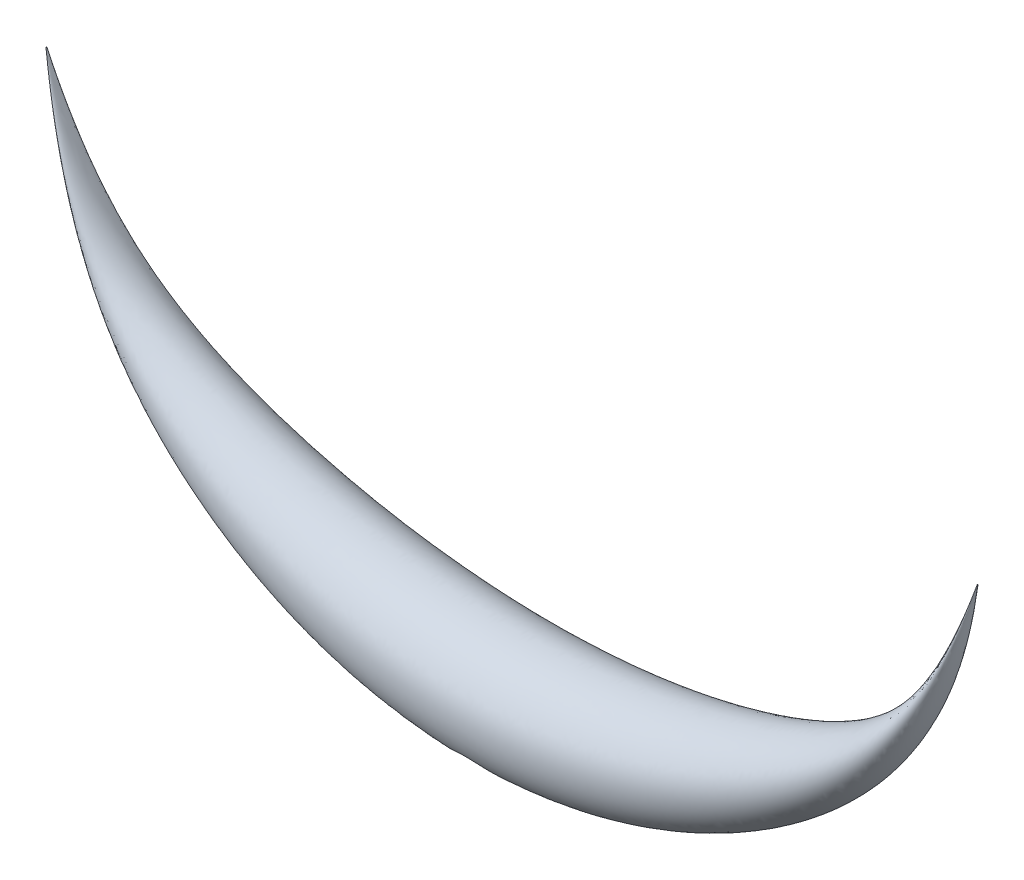
ISO-10303-21;
HEADER;
FILE_DESCRIPTION(('STEP AP214'),'2;1');
FILE_NAME('part.step','',(''),(''),'','','');
FILE_SCHEMA(('AUTOMOTIVE_DESIGN { 1 0 10303 214 1 1 1 1 }'));
ENDSEC;
DATA;
#1=APPLICATION_CONTEXT('core data for automotive mechanical design processes');
#2=APPLICATION_PROTOCOL_DEFINITION('international standard','automotive_design',2000,#1);
#3=PRODUCT_CONTEXT('',#1,'mechanical');
#4=PRODUCT('Part','Part','',(#3));
#5=PRODUCT_RELATED_PRODUCT_CATEGORY('part','',(#4));
#6=PRODUCT_DEFINITION_FORMATION('','',#4);
#7=PRODUCT_DEFINITION_CONTEXT('part definition',#1,'design');
#8=PRODUCT_DEFINITION('design','',#6,#7);
#9=PRODUCT_DEFINITION_SHAPE('','',#8);
#10=(LENGTH_UNIT() NAMED_UNIT(*) SI_UNIT(.MILLI.,.METRE.));
#11=(NAMED_UNIT(*) PLANE_ANGLE_UNIT() SI_UNIT($,.RADIAN.));
#12=(NAMED_UNIT(*) SI_UNIT($,.STERADIAN.) SOLID_ANGLE_UNIT());
#13=UNCERTAINTY_MEASURE_WITH_UNIT(LENGTH_MEASURE(1.E-05),#10,'distance_accuracy_value','');
#14=(GEOMETRIC_REPRESENTATION_CONTEXT(3) GLOBAL_UNCERTAINTY_ASSIGNED_CONTEXT((#13)) GLOBAL_UNIT_ASSIGNED_CONTEXT((#10,
#11,#12)) REPRESENTATION_CONTEXT('',''));
#15=CARTESIAN_POINT('',(0.,0.,0.));
#16=DIRECTION('',(0.,0.,1.));
#17=DIRECTION('',(1.,0.,0.));
#18=AXIS2_PLACEMENT_3D('',#15,#16,#17);
#19=CARTESIAN_POINT('',(-127.,76.2,0.));
#20=DIRECTION('',(1.,0.,0.));
#21=DIRECTION('',(0.,0.,-1.));
#22=AXIS2_PLACEMENT_3D('',#19,#20,#21);
#23=PLANE('',#22);
#24=CARTESIAN_POINT('',(-127.,76.2,0.));
#25=DIRECTION('',(1.,0.,0.));
#26=DIRECTION('',(0.,0.,-1.));
#27=AXIS2_PLACEMENT_3D('',#24,#25,#26);
#28=CIRCLE('',#27,0.126999999999999);
#29=CARTESIAN_POINT('',(-127.,76.2,-0.126999999999999));
#30=VERTEX_POINT('',#29);
#31=EDGE_CURVE('E93',#30,#30,#28,.T.);
#32=ORIENTED_EDGE('',*,*,#31,.F.);
#33=EDGE_LOOP('',(#32));
#34=FACE_BOUND('',#33,.T.);
#35=ADVANCED_FACE('F82',(#34),#23,.F.);
#36=CARTESIAN_POINT('',(127.,76.2,0.));
#37=DIRECTION('',(1.,0.,0.));
#38=DIRECTION('',(0.,0.,-1.));
#39=AXIS2_PLACEMENT_3D('',#36,#37,#38);
#40=PLANE('',#39);
#41=CARTESIAN_POINT('',(127.,76.2,0.));
#42=DIRECTION('',(1.,0.,0.));
#43=DIRECTION('',(0.,0.,-1.));
#44=AXIS2_PLACEMENT_3D('',#41,#42,#43);
#45=CIRCLE('',#44,0.127);
#46=CARTESIAN_POINT('',(127.,76.2,-0.127));
#47=VERTEX_POINT('',#46);
#48=EDGE_CURVE('E13',#47,#47,#45,.T.);
#49=ORIENTED_EDGE('',*,*,#48,.T.);
#50=EDGE_LOOP('',(#49));
#51=FACE_BOUND('',#50,.T.);
#52=ADVANCED_FACE('F138',(#51),#40,.T.);
#53=CARTESIAN_POINT('',(127.,76.2,0.127));
#54=CARTESIAN_POINT('',(121.877394895028,56.5062072073671,2.78380914411776));
#55=CARTESIAN_POINT('',(108.151194493748,24.8559641556503,7.24319604282338));
#56=CARTESIAN_POINT('',(40.8384139053685,-16.8181101400162,16.4046409217663));
#57=CARTESIAN_POINT('',(-40.8226490823428,-17.5555181786838,16.4341320573767));
#58=CARTESIAN_POINT('',(-108.178539865445,25.7387956800005,7.20762926537449));
#59=CARTESIAN_POINT('',(-121.790447376462,56.7590633122312,2.78845142418447));
#60=CARTESIAN_POINT('',(-127.,76.2,0.126999999999999));
#61=CARTESIAN_POINT('',(127.,76.203504660313,0.127));
#62=CARTESIAN_POINT('',(121.869229842429,56.572832944966,2.78542514880239));
#63=CARTESIAN_POINT('',(108.154156594016,25.0593973927103,7.24307855993581));
#64=CARTESIAN_POINT('',(40.8359252958178,-16.3678120669166,16.4028770904914));
#65=CARTESIAN_POINT('',(-40.8200717206475,-17.1045428024888,16.4519846289397));
#66=CARTESIAN_POINT('',(-108.181632681071,25.9414108152878,7.18406532377599));
#67=CARTESIAN_POINT('',(-121.781908620525,56.8253678254644,2.78033788555981));
#68=CARTESIAN_POINT('',(-127.,76.203504660313,0.126999999999999));
#69=CARTESIAN_POINT('',(127.,76.2104480488764,0.126715466031301));
#70=CARTESIAN_POINT('',(121.852640049468,56.7059762447544,2.78246375631468));
#71=CARTESIAN_POINT('',(108.160173665372,25.4620751103502,7.22659068427577));
#72=CARTESIAN_POINT('',(40.8308753680787,-15.4755973061404,16.3626540255355));
#73=CARTESIAN_POINT('',(-40.8148874431226,-16.2093288189421,16.4504928056587));
#74=CARTESIAN_POINT('',(-108.187847665399,26.3404867458463,7.12128473374578));
#75=CARTESIAN_POINT('',(-121.764753602198,56.957298229687,2.75787093079836));
#76=CARTESIAN_POINT('',(-127.,76.2104480488764,0.1267154660313));
#77=CARTESIAN_POINT('',(127.,76.2206325452478,0.125467853458071));
#78=CARTESIAN_POINT('',(121.827652530387,56.9001886166395,2.76001199292289));
#79=CARTESIAN_POINT('',(108.169232573866,26.0532060273289,7.1550225959381));
#80=CARTESIAN_POINT('',(40.8232884026087,-14.1676915242797,16.1964305448805));
#81=CARTESIAN_POINT('',(-40.8072353686186,-14.8921780057534,16.3408974134195));
#82=CARTESIAN_POINT('',(-108.197002650565,26.920542695059,6.98203517327966));
#83=CARTESIAN_POINT('',(-121.739494057835,57.1480816349626,2.70681209624914));
#84=CARTESIAN_POINT('',(-127.,76.2206325452478,0.12546785345807));
#85=CARTESIAN_POINT('',(127.,76.2305536648596,0.123432219550573));
#86=CARTESIAN_POINT('',(121.802493080746,57.0895358615887,2.71991771666272));
#87=CARTESIAN_POINT('',(108.17834964219,26.6291038416636,7.03860545459823));
#88=CARTESIAN_POINT('',(40.8156693125523,-12.894094980221,15.9284968930661));
#89=CARTESIAN_POINT('',(-40.7996940464706,-13.604793238508,16.1278888287643));
#90=CARTESIAN_POINT('',(-108.20600549289,27.4799359502469,6.79997406733427));
#91=CARTESIAN_POINT('',(-121.71466567611,57.3324409223358,2.63866196776117));
#92=CARTESIAN_POINT('',(-127.,76.2305536648596,0.123432219550572));
#93=CARTESIAN_POINT('',(127.,76.288303380257,0.106687029815467));
#94=CARTESIAN_POINT('',(121.651676437107,58.1897183263817,2.38308618104907));
#95=CARTESIAN_POINT('',(108.232979998006,29.9826841001341,6.08036761419493));
#96=CARTESIAN_POINT('',(40.7700997225591,-5.48424043855824,13.7374012493228));
#97=CARTESIAN_POINT('',(-40.7553225584774,-6.08601853123626,14.2552199689133));
#98=CARTESIAN_POINT('',(-108.258873785288,30.7031887569645,5.46117917039378));
#99=CARTESIAN_POINT('',(-121.568923013599,58.3941399358181,2.1378502576244));
#100=CARTESIAN_POINT('',(-127.,76.288303380257,0.106687029815467));
#101=CARTESIAN_POINT('',(127.,76.327,0.0560745650081868));
#102=CARTESIAN_POINT('',(121.508438043208,58.9457307702701,1.14256405987208));
#103=CARTESIAN_POINT('',(108.284571245364,32.228447181479,3.24434785712085));
#104=CARTESIAN_POINT('',(40.7282352369126,-0.539523567036197,7.14537081774753));
#105=CARTESIAN_POINT('',(-40.724698731056,-0.840829931121536,7.86471532738314));
#106=CARTESIAN_POINT('',(-108.293920993453,32.5897193173968,2.38441576863306));
#107=CARTESIAN_POINT('',(-121.473146707372,59.038090580725,0.777130416263664));
#108=CARTESIAN_POINT('',(-127.,76.327,0.0560745650081866));
#109=CARTESIAN_POINT('',(127.,76.327,-0.0700932062602336));
#110=CARTESIAN_POINT('',(121.510514080598,58.8906402950393,-1.42820507484011));
#111=CARTESIAN_POINT('',(108.283222468119,32.264546725995,-4.01914446152685));
#112=CARTESIAN_POINT('',(40.7317350302588,-0.633877420326688,-9.10639376951535));
#113=CARTESIAN_POINT('',(-40.7486864654327,-0.192221410546281,-8.40932023835093));
#114=CARTESIAN_POINT('',(-108.262415456816,31.7377972162597,-4.85214567031837));
#115=CARTESIAN_POINT('',(-121.561700733619,58.753987170792,-1.7750975564012));
#116=CARTESIAN_POINT('',(-127.,76.327,-0.0700932062602333));
#117=CARTESIAN_POINT('',(127.,76.2700932062603,-0.127));
#118=CARTESIAN_POINT('',(121.723753824246,57.7099941952826,-2.79099643116444));
#119=CARTESIAN_POINT('',(108.205667015155,29.0032175736573,-7.23141012066955));
#120=CARTESIAN_POINT('',(40.7976751920099,-8.00487851751205,-16.4510115316287));
#121=CARTESIAN_POINT('',(-40.8237061737292,-7.24621014824578,-16.0723198085233));
#122=CARTESIAN_POINT('',(-108.171493524014,28.0977012924721,-7.68372210347492));
#123=CARTESIAN_POINT('',(-121.813240775587,57.4518716658656,-2.93795110695498));
#124=CARTESIAN_POINT('',(-127.,76.2700932062602,-0.126999999999999));
#125=CARTESIAN_POINT('',(127.,76.1299067937398,-0.127));
#126=CARTESIAN_POINT('',(122.03103596581,55.3024202194516,-2.77662185707108));
#127=CARTESIAN_POINT('',(108.094337702018,20.7760880573626,-7.25450987945327));
#128=CARTESIAN_POINT('',(40.8906290805519,-25.9556561786317,-16.3605426513452));
#129=CARTESIAN_POINT('',(-40.9149891499561,-25.225507092317,-16.7774516687482));
#130=CARTESIAN_POINT('',(-108.062620707325,19.9049964289082,-6.7558835961852));
#131=CARTESIAN_POINT('',(-122.11343573033,55.0524205536147,-2.57048695432167));
#132=CARTESIAN_POINT('',(-127.,76.1299067937398,-0.126999999999999));
#133=CARTESIAN_POINT('',(127.,76.073,-0.0700932062602335));
#134=CARTESIAN_POINT('',(122.125078363726,54.1018651684183,-1.39945592665339));
#135=CARTESIAN_POINT('',(108.060563841845,17.5067701427577,-4.06148316279525));
#136=CARTESIAN_POINT('',(40.9176428073429,-33.2595071699763,-8.94403968649659));
#137=CARTESIAN_POINT('',(-40.9312524178864,-32.8690713551201,-9.66834721760975));
#138=CARTESIAN_POINT('',(-108.044669823438,17.0418607932517,-3.19558500606741));
#139=CARTESIAN_POINT('',(-122.162090643105,53.9814577713313,-1.04016925113459));
#140=CARTESIAN_POINT('',(-127.,76.073,-0.0700932062602333));
#141=CARTESIAN_POINT('',(127.,76.073,0.0560745650081868));
#142=CARTESIAN_POINT('',(122.128602880823,54.0470223346474,1.11956474132271));
#143=CARTESIAN_POINT('',(108.059782638899,17.5090209933886,3.22015424233682));
#144=CARTESIAN_POINT('',(40.9163227828874,-33.1912904591212,7.29497594706202));
#145=CARTESIAN_POINT('',(-40.9128801563255,-33.5429502641393,6.59741863738539));
#146=CARTESIAN_POINT('',(-108.068988222885,17.9310995361349,4.05376877247556));
#147=CARTESIAN_POINT('',(-122.093638419953,54.1584944607743,1.47508302976497));
#148=CARTESIAN_POINT('',(-127.,76.073,0.0560745650081866));
#149=CARTESIAN_POINT('',(127.,76.1116966197431,0.106687029815468));
#150=CARTESIAN_POINT('',(122.067649889774,54.8167833606449,2.30632595539054));
#151=CARTESIAN_POINT('',(108.082084841312,19.7366957534396,6.0846798038122));
#152=CARTESIAN_POINT('',(40.8968314278825,-28.179324481513,13.8272878301288));
#153=CARTESIAN_POINT('',(-40.8862047118061,-28.8152826540896,13.3575427057305));
#154=CARTESIAN_POINT('',(-108.101865463457,20.4984855816088,6.64587459615545));
#155=CARTESIAN_POINT('',(-122.002368689587,55.0372303387536,2.55449790933455));
#156=CARTESIAN_POINT('',(-127.,76.111696619743,0.106687029815467));
#157=CARTESIAN_POINT('',(127.,76.1694463351404,0.123432219550573));
#158=CARTESIAN_POINT('',(121.945918839933,55.9218237966924,2.69231357180036));
#159=CARTESIAN_POINT('',(108.126319470326,23.0841381972813,7.04046120526077));
#160=CARTESIAN_POINT('',(40.8593764501221,-20.7469284690105,15.9593532816588));
#161=CARTESIAN_POINT('',(-40.8449080508392,-21.4694374973011,15.817018804899));
#162=CARTESIAN_POINT('',(-108.151755940985,23.9492364204335,7.21027748643516));
#163=CARTESIAN_POINT('',(-121.864435772423,56.1703259301014,2.78170987553789));
#164=CARTESIAN_POINT('',(-127.,76.1694463351404,0.123432219550572));
#165=CARTESIAN_POINT('',(127.,76.1793674547522,0.125467853458071));
#166=CARTESIAN_POINT('',(121.924371234562,56.111770846517,2.74103772931726));
#167=CARTESIAN_POINT('',(108.134145495777,23.659287229341,7.15639168198293));
#168=CARTESIAN_POINT('',(40.8527655281334,-19.4705922959351,16.2171902570951));
#169=CARTESIAN_POINT('',(-40.8377526036528,-20.2030498110132,16.1308772016707));
#170=CARTESIAN_POINT('',(-108.160383675199,24.5362520874845,7.25924341232079));
#171=CARTESIAN_POINT('',(-121.840592173533,56.3634588138609,2.80302473522535));
#172=CARTESIAN_POINT('',(-127.,76.1793674547522,0.12546785345807));
#173=CARTESIAN_POINT('',(127.,76.1895519511236,0.126715466031301));
#174=CARTESIAN_POINT('',(121.901630365065,56.3063536832858,2.77276772820691));
#175=CARTESIAN_POINT('',(108.142401063762,24.2499581002367,7.22731488568265));
#176=CARTESIAN_POINT('',(40.8458070253829,-18.161006116875,16.3731440947969));
#177=CARTESIAN_POINT('',(-40.8303516132945,-18.8987723563944,16.3441335599871));
#178=CARTESIAN_POINT('',(-108.169290771641,25.1332433006431,7.26167280158513));
#179=CARTESIAN_POINT('',(-121.815986137823,56.559603014413,2.80655216254628));
#180=CARTESIAN_POINT('',(-127.,76.1895519511236,0.1267154660313));
#181=CARTESIAN_POINT('',(127.,76.196495339687,0.127));
#182=CARTESIAN_POINT('',(121.885559947628,56.4395814697681,2.78219313943313));
#183=CARTESIAN_POINT('',(108.148232393479,24.6525309185902,7.24331352571094));
#184=CARTESIAN_POINT('',(40.8409025149192,-17.2684082131158,16.4064047530412));
#185=CARTESIAN_POINT('',(-40.8252264440381,-18.0064935548788,16.4162794858138));
#186=CARTESIAN_POINT('',(-108.175447049819,25.5361805447132,7.23119320697299));
#187=CARTESIAN_POINT('',(-121.7989861324,56.6927587989981,2.79656496280912));
#188=CARTESIAN_POINT('',(-127.,76.196495339687,0.126999999999999));
#189=CARTESIAN_POINT('',(127.,76.2,0.127));
#190=CARTESIAN_POINT('',(121.877394895028,56.5062072073671,2.78380914411776));
#191=CARTESIAN_POINT('',(108.151194493748,24.8559641556503,7.24319604282338));
#192=CARTESIAN_POINT('',(40.8384139053685,-16.8181101400162,16.4046409217663));
#193=CARTESIAN_POINT('',(-40.8226490823428,-17.5555181786838,16.4341320573767));
#194=CARTESIAN_POINT('',(-108.178539865445,25.7387956800005,7.20762926537449));
#195=CARTESIAN_POINT('',(-121.790447376462,56.7590633122312,2.78845142418447));
#196=CARTESIAN_POINT('',(-127.,76.2,0.126999999999999));
#197=B_SPLINE_SURFACE_WITH_KNOTS('',3,3,((#53,#54,#55,#56,#57,#58,#59,#60),(#61,#62,#63,#64,#65,
#66,#67,#68),(#69,#70,#71,#72,#73,#74,#75,#76),(#77,#78,#79,#80,#81,#82,#83,#84),(#85,#86,#87,
#88,#89,#90,#91,#92),(#93,#94,#95,#96,#97,#98,#99,#100),(#101,#102,#103,#104,#105,#106,#107,
#108),(#109,#110,#111,#112,#113,#114,#115,#116),(#117,#118,#119,#120,#121,#122,#123,#124),(#125,
#126,#127,#128,#129,#130,#131,#132),(#133,#134,#135,#136,#137,#138,#139,#140),(#141,#142,#143,
#144,#145,#146,#147,#148),(#149,#150,#151,#152,#153,#154,#155,#156),(#157,#158,#159,#160,#161,
#162,#163,#164),(#165,#166,#167,#168,#169,#170,#171,#172),(#173,#174,#175,#176,#177,#178,#179,
#180),(#181,#182,#183,#184,#185,#186,#187,#188),(#189,#190,#191,#192,#193,#194,#195,#196)),
.UNSPECIFIED.,.T.,.F.,.F.,(4,1,1,1,1,2,2,2,1,1,1,1,4),(4,1,1,1,1,4),(0.,0.0125,
0.0249999999999999,0.0375000000000001,0.05,0.25,0.5,0.75,0.95,0.9625,0.975,0.9875,1.),(0.,
0.171664779920247,0.30971821396135,0.690274823693463,0.828340998724798,1.),.UNSPECIFIED.);
#198=CARTESIAN_POINT('',(0.,-21.5043256238537,12.7));
#199=CARTESIAN_POINT('',(-0.19703676074705,-21.5043718118875,12.7000025147216));
#200=CARTESIAN_POINT('',(-0.394042936532909,-21.5104934323985,12.695409266262));
#201=CARTESIAN_POINT('',(-0.786895048973702,-21.5346310977054,12.6771228398674));
#202=CARTESIAN_POINT('',(-0.982741049328081,-21.5526464832509,12.6634301662972));
#203=CARTESIAN_POINT('',(-1.37240121608189,-21.5999597915899,12.6271472284336));
#204=CARTESIAN_POINT('',(-1.5662133453888,-21.6292680886677,12.6045487823761));
#205=CARTESIAN_POINT('',(-1.95079377993068,-21.698205242674,12.550781883071));
#206=CARTESIAN_POINT('',(-2.14156152071458,-21.737835990397,12.5196118596832));
#207=CARTESIAN_POINT('',(-2.6222412440616,-21.8503508339816,12.4298789694902));
#208=CARTESIAN_POINT('',(-2.90962411565026,-21.9295958093644,12.3656392414301));
#209=CARTESIAN_POINT('',(-3.47426489014922,-22.1054911066995,12.2190299911392));
#210=CARTESIAN_POINT('',(-3.75151751530605,-22.2021503500641,12.1366511713366));
#211=CARTESIAN_POINT('',(-4.29612056420111,-22.4089022013416,11.9547481656051));
#212=CARTESIAN_POINT('',(-4.56343999526694,-22.5190328911334,11.8551750311633));
#213=CARTESIAN_POINT('',(-5.08725088026957,-22.748788607995,11.6400194907931));
#214=CARTESIAN_POINT('',(-5.34374250319531,-22.8684134868057,11.5244373348371));
#215=CARTESIAN_POINT('',(-5.94808768300252,-23.1639313148968,11.2278705243716));
#216=CARTESIAN_POINT('',(-6.29075128743078,-23.342949270337,11.0393854913323));
#217=CARTESIAN_POINT('',(-6.95525239798275,-23.7066153507403,10.6332559345908));
#218=CARTESIAN_POINT('',(-7.27708241920783,-23.8912654645057,10.4156010162815));
#219=CARTESIAN_POINT('',(-7.89967214998013,-24.2606633750072,9.95167962565006));
#220=CARTESIAN_POINT('',(-8.20042154566207,-24.4454111756124,9.7053993026046));
#221=CARTESIAN_POINT('',(-8.77963955247185,-24.8101061156239,9.18474429434821));
#222=CARTESIAN_POINT('',(-9.0581113364007,-24.9900539362064,8.91037362252917));
#223=CARTESIAN_POINT('',(-9.5927847959559,-25.3419314733777,8.33213428468447));
#224=CARTESIAN_POINT('',(-9.84883925075869,-25.513805181184,8.02809486082744));
#225=CARTESIAN_POINT('',(-10.3343930688478,-25.8441628505968,7.3925774047484));
#226=CARTESIAN_POINT('',(-10.5638890080698,-26.0026450849945,7.06109584397017));
#227=CARTESIAN_POINT('',(-10.9927517249134,-26.3016790548019,6.37286267256703));
#228=CARTESIAN_POINT('',(-11.192194154689,-26.4422756687513,6.01617794944106));
#229=CARTESIAN_POINT('',(-11.5581908557693,-26.7019406675098,5.27895295209165));
#230=CARTESIAN_POINT('',(-11.7247621083423,-26.8210201653772,4.89842512980007));
#231=CARTESIAN_POINT('',(-11.976201211043,-27.0013967632959,4.23615501310176));
#232=CARTESIAN_POINT('',(-12.0704868720466,-27.0692353213694,3.95972476988445));
#233=CARTESIAN_POINT('',(-12.2403933619295,-27.1916135703541,3.39833898883756));
#234=CARTESIAN_POINT('',(-12.3160186147382,-27.2461564133192,3.11338548966096));
#235=CARTESIAN_POINT('',(-12.4475824098583,-27.3409837346513,2.53675294269571));
#236=CARTESIAN_POINT('',(-12.5035287490269,-27.3812738600329,2.24507660743562));
#237=CARTESIAN_POINT('',(-12.5949763617465,-27.4469316988803,1.65685127551129));
#238=CARTESIAN_POINT('',(-12.6304767728576,-27.4722987828707,1.36030207384483));
#239=CARTESIAN_POINT('',(-12.6805486693132,-27.5077383278226,0.763842818557927));
#240=CARTESIAN_POINT('',(-12.6950720414204,-27.5177756311945,0.463926623736369));
#241=CARTESIAN_POINT('',(-12.7028149024591,-27.5224329567359,-0.136300638924243));
#242=CARTESIAN_POINT('',(-12.6960342945186,-27.5170529088008,-0.436611708552635));
#243=CARTESIAN_POINT('',(-12.661278626839,-27.4909642827526,-1.03535344357831));
#244=CARTESIAN_POINT('',(-12.6333020144643,-27.4702545817246,-1.33378396960846));
#245=CARTESIAN_POINT('',(-12.5565875470338,-27.4137292198958,-1.92650188894049));
#246=CARTESIAN_POINT('',(-12.5078502033034,-27.3779139311375,-2.22078938409853));
#247=CARTESIAN_POINT('',(-12.3922323439632,-27.2931630433156,-2.79378730347495));
#248=CARTESIAN_POINT('',(-12.3259855424562,-27.2446863071684,-3.0726943428258));
#249=CARTESIAN_POINT('',(-12.1755896339006,-27.1349195845629,-3.62303667605112));
#250=CARTESIAN_POINT('',(-12.0914408890194,-27.0736298573198,-3.89447212095515));
#251=CARTESIAN_POINT('',(-11.9062319848071,-26.9391923814135,-4.4284898903843));
#252=CARTESIAN_POINT('',(-11.8051707510298,-26.8660438793746,-4.69107165116295));
#253=CARTESIAN_POINT('',(-11.5871974247745,-26.7089723282583,-5.20625683346557));
#254=CARTESIAN_POINT('',(-11.4702832610393,-26.6250478713296,-5.45885894552462));
#255=CARTESIAN_POINT('',(-11.2108134977267,-26.4398358387859,-5.97479467525938));
#256=CARTESIAN_POINT('',(-11.0669096631535,-26.3376716746631,-6.23713503424908));
#257=CARTESIAN_POINT('',(-10.7629729974654,-26.1235544961117,-6.74809592348057));
#258=CARTESIAN_POINT('',(-10.6029393504156,-26.011600986522,-6.996715758677));
#259=CARTESIAN_POINT('',(-10.2678938763321,-25.7794508579676,-7.47975896556969));
#260=CARTESIAN_POINT('',(-10.0928755051429,-25.6592506420862,-7.7141760575157));
#261=CARTESIAN_POINT('',(-9.72898211277965,-25.4122598155383,-8.16832880093232));
#262=CARTESIAN_POINT('',(-9.54010560194002,-25.2854684967965,-8.38806286920221));
#263=CARTESIAN_POINT('',(-9.11251743135697,-25.0025366423268,-8.8526628115077));
#264=CARTESIAN_POINT('',(-8.87112772123881,-24.8453729882902,-9.09444579465264));
#265=CARTESIAN_POINT('',(-8.37117602580726,-24.5269127131688,-9.55663893266993));
#266=CARTESIAN_POINT('',(-8.11261106348432,-24.3656153785791,-9.77704536594313));
#267=CARTESIAN_POINT('',(-7.5788321506161,-24.041862124067,-10.1964022579409));
#268=CARTESIAN_POINT('',(-7.30360261515679,-23.8794052489682,-10.3953321322305));
#269=CARTESIAN_POINT('',(-6.73710084793155,-23.5570320724031,-10.7711188282031));
#270=CARTESIAN_POINT('',(-6.4458313437007,-23.3971153449168,-10.9479793860859));
#271=CARTESIAN_POINT('',(-5.89585573962092,-23.1094546477723,-11.2521524068094));
#272=CARTESIAN_POINT('',(-5.63954409914678,-22.9807037093959,-11.3828468898077));
#273=CARTESIAN_POINT('',(-5.11547758568686,-22.7309055244686,-11.6277921399637));
#274=CARTESIAN_POINT('',(-4.84772200587792,-22.6098587549105,-11.7420418895203));
#275=CARTESIAN_POINT('',(-4.30118512157634,-22.379290747131,-11.9530525106456));
#276=CARTESIAN_POINT('',(-4.02242441424235,-22.2697492630964,-12.0498443257929));
#277=CARTESIAN_POINT('',(-3.45364219412383,-22.0662462338002,-12.2250074374945));
#278=CARTESIAN_POINT('',(-3.16362508249498,-21.9722786735176,-12.3033858506497));
#279=CARTESIAN_POINT('',(-2.65188507777992,-21.8270757257295,-12.4220334861008));
#280=CARTESIAN_POINT('',(-2.43256077077693,-21.7711261148745,-12.466892140081));
#281=CARTESIAN_POINT('',(-1.98900959423909,-21.6721504032233,-12.5452991976385));
#282=CARTESIAN_POINT('',(-1.76478341710156,-21.6291224897084,-12.5788491877312));
#283=CARTESIAN_POINT('',(-1.31294132822088,-21.5578238538955,-12.6339969548445));
#284=CARTESIAN_POINT('',(-1.08533238123868,-21.5295262331598,-12.6556165219366));
#285=CARTESIAN_POINT('',(-0.627843769533828,-21.4888894437527,-12.6865425707067));
#286=CARTESIAN_POINT('',(-0.397964143103842,-21.4765500064243,-12.6958492596726));
#287=CARTESIAN_POINT('',(0.0630290952008403,-21.4684375302259,-12.701942358591));
#288=CARTESIAN_POINT('',(0.294144261524683,-21.4727201043006,-12.6986867385237));
#289=CARTESIAN_POINT('',(0.75494583988414,-21.4977554621252,-12.6796388555579));
#290=CARTESIAN_POINT('',(0.984632245145832,-21.5185083239028,-12.6638465332671));
#291=CARTESIAN_POINT('',(1.44123936535723,-21.5755108247041,-12.6200445258718));
#292=CARTESIAN_POINT('',(1.66815513996879,-21.6117848842686,-12.5920155866615));
#293=CARTESIAN_POINT('',(2.11753933221261,-21.6982247463438,-12.524284247772));
#294=CARTESIAN_POINT('',(2.34000704169774,-21.7483927422302,-12.484580004902));
#295=CARTESIAN_POINT('',(2.85830083185332,-21.880827759662,-12.377922704302));
#296=CARTESIAN_POINT('',(3.15187696209188,-21.9681565060025,-12.3063032240051));
#297=CARTESIAN_POINT('',(3.72798152255311,-22.1599979421304,-12.1442089855812));
#298=CARTESIAN_POINT('',(4.01050534891988,-22.2645177004724,-12.0537264672897));
#299=CARTESIAN_POINT('',(4.56484096095083,-22.4865255053036,-11.8549212624739));
#300=CARTESIAN_POINT('',(4.83662228859948,-22.6040472722922,-11.7465518111172));
#301=CARTESIAN_POINT('',(5.36869325588252,-22.8479838954969,-11.5131028431867));
#302=CARTESIAN_POINT('',(5.62898297832639,-22.9743986876121,-11.3880234470524));
#303=CARTESIAN_POINT('',(6.2333716137458,-23.2812116929556,-11.0720764225885));
#304=CARTESIAN_POINT('',(6.57247731623312,-23.464143071371,-10.8740819846019));
#305=CARTESIAN_POINT('',(7.22952867916064,-23.8340798800595,-10.4487843918092));
#306=CARTESIAN_POINT('',(7.5474668138205,-24.0210867282641,-10.2214708965745));
#307=CARTESIAN_POINT('',(8.1613686580009,-24.3935734143106,-9.73830085171848));
#308=CARTESIAN_POINT('',(8.4573486538418,-24.5790542913109,-9.48246581621369));
#309=CARTESIAN_POINT('',(9.02632937905591,-24.9438875228079,-8.94254442753783));
#310=CARTESIAN_POINT('',(9.29933693081748,-25.1232416873577,-8.65846651703884));
#311=CARTESIAN_POINT('',(9.77598498984408,-25.4417707274619,-8.11343480666342));
#312=CARTESIAN_POINT('',(9.98350806895026,-25.5825751365223,-7.85682170617075));
#313=CARTESIAN_POINT('',(10.3800473453542,-25.8546438286111,-7.32493085739916));
#314=CARTESIAN_POINT('',(10.5690667717617,-25.9859097751818,-7.049656379997));
#315=CARTESIAN_POINT('',(10.9267207813943,-26.2364292984212,-6.48146026405825));
#316=CARTESIAN_POINT('',(11.0953788104226,-26.355696664345,-6.18855951589797));
#317=CARTESIAN_POINT('',(11.4106473762247,-26.5800846673154,-5.58593772612195));
#318=CARTESIAN_POINT('',(11.5572612381379,-26.6852074376791,-5.27621923090568));
#319=CARTESIAN_POINT('',(11.8062658365537,-26.8645773679481,-4.68913385896017));
#320=CARTESIAN_POINT('',(11.9119911747416,-26.9410907383942,-4.41387048611404));
#321=CARTESIAN_POINT('',(12.1048250225183,-27.0810491645347,-3.85368899411236));
#322=CARTESIAN_POINT('',(12.1919368383248,-27.1444965409971,-3.56877260000369));
#323=CARTESIAN_POINT('',(12.3464048559485,-27.2572272695433,-2.99093676098764));
#324=CARTESIAN_POINT('',(12.4137648825157,-27.3065133637903,-2.69801887751903));
#325=CARTESIAN_POINT('',(12.527784568379,-27.390074527103,-2.1060534562725));
#326=CARTESIAN_POINT('',(12.5744439194566,-27.4243493726618,-1.8070058272964));
#327=CARTESIAN_POINT('',(12.6464510461651,-27.4773823906896,-1.20405012627426));
#328=CARTESIAN_POINT('',(12.6717332700467,-27.4960928329797,-0.900129995271589));
#329=CARTESIAN_POINT('',(12.700336917904,-27.5176402915387,-0.290690888698753));
#330=CARTESIAN_POINT('',(12.7036580708392,-27.5204771118975,0.0148281065577913));
#331=CARTESIAN_POINT('',(12.6882813208159,-27.5101991143158,0.625026510242922));
#332=CARTESIAN_POINT('',(12.6695845020635,-27.497085081824,0.929705959271858));
#333=CARTESIAN_POINT('',(12.6104697342116,-27.4549891483776,1.53582802168383));
#334=CARTESIAN_POINT('',(12.5700526912571,-27.4260079093853,1.83727076956358));
#335=CARTESIAN_POINT('',(12.4706847320415,-27.3545160742955,2.41968791999113));
#336=CARTESIAN_POINT('',(12.4127629114045,-27.3127553883029,2.70093154928577));
#337=CARTESIAN_POINT('',(12.2786661075515,-27.216050620028,3.25669658628784));
#338=CARTESIAN_POINT('',(12.2024917249484,-27.1611069715397,3.53121821485963));
#339=CARTESIAN_POINT('',(12.0328176088037,-27.0389179124241,4.07205617845575));
#340=CARTESIAN_POINT('',(11.9393161228087,-26.9716712574863,4.33837168033675));
#341=CARTESIAN_POINT('',(11.7360277165647,-26.8259166081414,4.86152473694903));
#342=CARTESIAN_POINT('',(11.6262399888176,-26.7474080553575,5.11836182093619));
#343=CARTESIAN_POINT('',(11.383029150935,-26.5742698829273,5.63960872538676));
#344=CARTESIAN_POINT('',(11.2484756263582,-26.4788878854728,5.90324053099));
#345=CARTESIAN_POINT('',(10.9631959286348,-26.2779685621715,6.41754056172205));
#346=CARTESIAN_POINT('',(10.8124691143713,-26.1724308337638,6.6682082723639));
#347=CARTESIAN_POINT('',(10.4960141218307,-25.9526799903331,7.1559930493243));
#348=CARTESIAN_POINT('',(10.3302815263275,-25.8384643224019,7.39310609185));
#349=CARTESIAN_POINT('',(9.98492975004729,-25.6029070239895,7.85327678413312));
#350=CARTESIAN_POINT('',(9.80530876827412,-25.4815644698115,8.07633260417026));
#351=CARTESIAN_POINT('',(9.39933309764383,-25.210767104301,8.54727742250003));
#352=CARTESIAN_POINT('',(9.17041384700768,-25.0602076350195,8.79232420273389));
#353=CARTESIAN_POINT('',(8.69573269397189,-24.7539312879321,9.26206052190246));
#354=CARTESIAN_POINT('',(8.44996831977327,-24.5982136549736,9.48674706196081));
#355=CARTESIAN_POINT('',(7.9422064179752,-24.2842550871741,9.91574266283054));
#356=CARTESIAN_POINT('',(7.68019116766403,-24.1260115423953,10.1200288188639));
#357=CARTESIAN_POINT('',(7.14070057228361,-23.8102835996003,10.5076508381072));
#358=CARTESIAN_POINT('',(6.86322673584463,-23.6527991291288,10.6909887403843));
#359=CARTESIAN_POINT('',(6.31718308357722,-23.3553785697412,11.0216251253106));
#360=CARTESIAN_POINT('',(6.04985935002795,-23.2150882541256,11.1706621095052));
#361=CARTESIAN_POINT('',(5.50226495670501,-22.941442682869,11.4503109908167));
#362=CARTESIAN_POINT('',(5.22199319279676,-22.8080880207301,11.5809213127482));
#363=CARTESIAN_POINT('',(4.64861760192131,-22.5524580941833,11.8227331612327));
#364=CARTESIAN_POINT('',(4.35552830417441,-22.4301707437998,11.9339559857887));
#365=CARTESIAN_POINT('',(3.90626775983679,-22.2586627258676,12.0853641183176));
#366=CARTESIAN_POINT('',(3.75492825323747,-22.2034863670268,12.1332577327518));
#367=CARTESIAN_POINT('',(3.44900731382964,-22.097767718877,12.2237394621565));
#368=CARTESIAN_POINT('',(3.29442474642965,-22.0472270857615,12.2663256829027));
#369=CARTESIAN_POINT('',(2.88853616498371,-21.9228358289398,12.3698328810466));
#370=CARTESIAN_POINT('',(2.63480160247827,-21.8531752428241,12.4264399933366));
#371=CARTESIAN_POINT('',(2.12046778402251,-21.7307761254693,12.5244600524873));
#372=CARTESIAN_POINT('',(1.85987139410355,-21.6780306467859,12.5658792384025));
#373=CARTESIAN_POINT('',(1.33413002891215,-21.5924277662286,12.6325007822857));
#374=CARTESIAN_POINT('',(1.06900075998783,-21.5595120886396,12.6577506724016));
#375=CARTESIAN_POINT('',(0.535894893010888,-21.5154328741479,12.6914960616587));
#376=CARTESIAN_POINT('',(0.267919172261194,-21.504262820041,12.6999965806273));
#377=CARTESIAN_POINT('',(0.,-21.5043256238537,12.7));
#378=B_SPLINE_CURVE_WITH_KNOTS('',3,(#198,#199,#200,#201,#202,#203,#204,#205,#206,#207,#208,
#209,#210,#211,#212,#213,#214,#215,#216,#217,#218,#219,#220,#221,#222,#223,#224,#225,#226,#227,
#228,#229,#230,#231,#232,#233,#234,#235,#236,#237,#238,#239,#240,#241,#242,#243,#244,#245,#246,
#247,#248,#249,#250,#251,#252,#253,#254,#255,#256,#257,#258,#259,#260,#261,#262,#263,#264,#265,
#266,#267,#268,#269,#270,#271,#272,#273,#274,#275,#276,#277,#278,#279,#280,#281,#282,#283,#284,
#285,#286,#287,#288,#289,#290,#291,#292,#293,#294,#295,#296,#297,#298,#299,#300,#301,#302,#303,
#304,#305,#306,#307,#308,#309,#310,#311,#312,#313,#314,#315,#316,#317,#318,#319,#320,#321,#322,
#323,#324,#325,#326,#327,#328,#329,#330,#331,#332,#333,#334,#335,#336,#337,#338,#339,#340,#341,
#342,#343,#344,#345,#346,#347,#348,#349,#350,#351,#352,#353,#354,#355,#356,#357,#358,#359,#360,
#361,#362,#363,#364,#365,#366,#367,#368,#369,#370,#371,#372,#373,#374,#375,#376,#377),
.UNSPECIFIED.,.T.,.F.,(4,2,2,2,2,2,2,2,2,2,2,2,2,2,2,2,2,2,2,2,2,2,2,2,2,2,2,2,2,2,2,2,2,2,2,2,
2,2,2,2,2,2,2,2,2,2,2,2,2,2,2,2,2,2,2,2,2,2,2,2,2,2,2,2,2,2,2,2,2,2,2,2,2,2,2,2,2,2,2,2,2,2,2,2,
2,2,2,2,2,4),(0.,0.590915624578059,1.18179849849875,1.77322548882121,2.36476088889709,
3.2781381180899,4.1919846122984,5.10847686190064,6.0249548025733,7.31355292274687,
8.60261145830356,9.89229633638054,11.18179720796,12.4792148159643,13.7767995079933,
15.0710612392986,16.3646525938184,17.2632814412636,18.1616970405085,19.0597562822214,
19.9578534026478,20.8580071582222,21.7581650069151,22.6583887997442,23.5585904218397,
24.4298490762601,25.3010901062545,26.1723865069938,27.0437968564539,27.991410831323,
28.9390727658216,29.8871506968563,30.8353306902254,31.9624493099585,33.0897638070535,
34.2181493736285,35.3463436515324,36.2913031000433,37.2363209975847,38.1796470610856,
39.1226079362239,39.8142552311592,40.5058054530646,41.1960883914272,41.8863597086862,
42.5789424825457,43.2715285375224,43.9652083147485,44.6589976626785,45.601162755833,
46.5437162188503,47.4887741702313,48.4338253103325,49.7317243679461,51.0300824348453,
52.3274676788786,53.6244662536811,54.6998849300881,55.7751155971911,56.8490961002767,
57.9229144414057,58.835880464335,59.7486841870745,60.6613110369717,61.5739514747774,
62.4893804269108,63.4048206771148,64.3202158512124,65.2355728389481,66.1051068665225,
66.9746122854301,67.8442056936676,68.7138422321607,69.6458498047727,70.577894336261,
71.5102141296775,72.4426550263975,73.5443585154213,74.6462240123811,75.7493130518864,
76.8522946269535,77.8615753732942,78.8709423448116,79.8791933976624,80.383199893387,
80.8873857584836,81.693831871431,82.499946331941,83.3036800821343,84.1071729147047),.UNSPECIFIED.);
#379=CARTESIAN_POINT('',(0.,-21.5043256238537,12.7));
#380=VERTEX_POINT('',#379);
#381=EDGE_CURVE('E86',#380,#380,#378,.T.);
#382=ORIENTED_EDGE('',*,*,#381,.F.);
#383=EDGE_LOOP('',(#382));
#384=FACE_BOUND('',#383,.T.);
#385=ORIENTED_EDGE('',*,*,#48,.F.);
#386=EDGE_LOOP('',(#385));
#387=FACE_BOUND('',#386,.T.);
#388=ORIENTED_EDGE('',*,*,#31,.T.);
#389=EDGE_LOOP('',(#388));
#390=FACE_BOUND('',#389,.T.);
#391=ADVANCED_FACE('F120',(#384,#387,#390),#197,.T.);
#392=CARTESIAN_POINT('',(0.,-33.5430124911248,0.));
#393=DIRECTION('',(0.,1.,0.));
#394=DIRECTION('',(0.,0.,1.));
#395=AXIS2_PLACEMENT_3D('',#392,#393,#394);
#396=CYLINDRICAL_SURFACE('',#395,12.7);
#397=ORIENTED_EDGE('',*,*,#381,.T.);
#398=EDGE_LOOP('',(#397));
#399=FACE_BOUND('',#398,.T.);
#400=CARTESIAN_POINT('',(0.,-15.24,0.));
#401=DIRECTION('',(0.,1.,0.));
#402=DIRECTION('',(0.,0.,1.));
#403=AXIS2_PLACEMENT_3D('',#400,#401,#402);
#404=CIRCLE('',#403,12.7);
#405=CARTESIAN_POINT('',(0.,-15.24,12.7));
#406=VERTEX_POINT('',#405);
#407=EDGE_CURVE('E189',#406,#406,#404,.T.);
#408=ORIENTED_EDGE('',*,*,#407,.T.);
#409=EDGE_LOOP('',(#408));
#410=FACE_BOUND('',#409,.T.);
#411=ADVANCED_FACE('F137',(#399,#410),#396,.F.);
#412=CARTESIAN_POINT('',(0.,-15.24,0.));
#413=DIRECTION('',(0.,1.,0.));
#414=DIRECTION('',(0.,0.,1.));
#415=AXIS2_PLACEMENT_3D('',#412,#413,#414);
#416=PLANE('',#415);
#417=ORIENTED_EDGE('',*,*,#407,.F.);
#418=EDGE_LOOP('',(#417));
#419=FACE_BOUND('',#418,.T.);
#420=ADVANCED_FACE('F152',(#419),#416,.F.);
#421=CLOSED_SHELL('',(#35,#52,#391,#411,#420));
#422=MANIFOLD_SOLID_BREP('B2',#421);
#423=ADVANCED_BREP_SHAPE_REPRESENTATION('',(#18,#422),#14);
#424=SHAPE_DEFINITION_REPRESENTATION(#9,#423);
ENDSEC;
END-ISO-10303-21;
